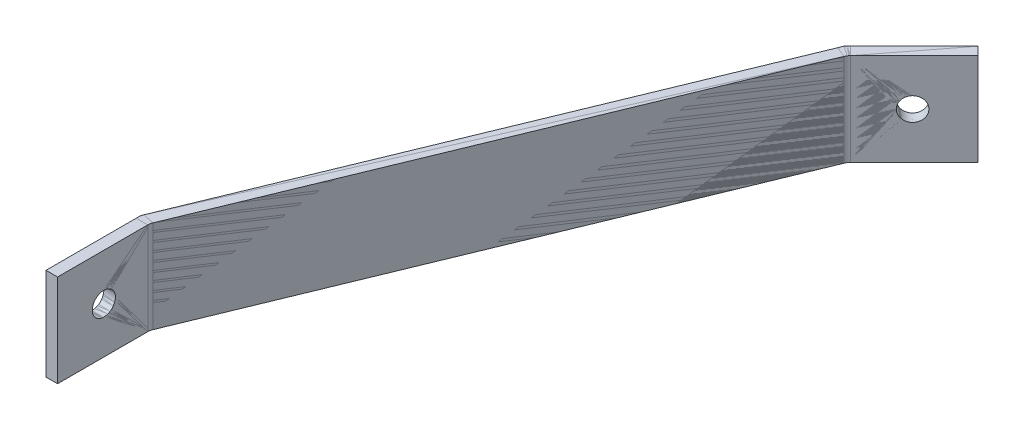
ISO-10303-21;
HEADER;
FILE_DESCRIPTION(('STEP AP214'),'2;1');
FILE_NAME('part.step','',(''),(''),'','','');
FILE_SCHEMA(('AUTOMOTIVE_DESIGN { 1 0 10303 214 1 1 1 1 }'));
ENDSEC;
DATA;
#1=APPLICATION_CONTEXT('core data for automotive mechanical design processes');
#2=APPLICATION_PROTOCOL_DEFINITION('international standard','automotive_design',2000,#1);
#3=PRODUCT_CONTEXT('',#1,'mechanical');
#4=PRODUCT('Part','Part','',(#3));
#5=PRODUCT_RELATED_PRODUCT_CATEGORY('part','',(#4));
#6=PRODUCT_DEFINITION_FORMATION('','',#4);
#7=PRODUCT_DEFINITION_CONTEXT('part definition',#1,'design');
#8=PRODUCT_DEFINITION('design','',#6,#7);
#9=PRODUCT_DEFINITION_SHAPE('','',#8);
#10=(LENGTH_UNIT() NAMED_UNIT(*) SI_UNIT(.MILLI.,.METRE.));
#11=(NAMED_UNIT(*) PLANE_ANGLE_UNIT() SI_UNIT($,.RADIAN.));
#12=(NAMED_UNIT(*) SI_UNIT($,.STERADIAN.) SOLID_ANGLE_UNIT());
#13=UNCERTAINTY_MEASURE_WITH_UNIT(LENGTH_MEASURE(1.E-05),#10,'distance_accuracy_value','');
#14=(GEOMETRIC_REPRESENTATION_CONTEXT(3) GLOBAL_UNCERTAINTY_ASSIGNED_CONTEXT((#13)) GLOBAL_UNIT_ASSIGNED_CONTEXT((#10,
#11,#12)) REPRESENTATION_CONTEXT('',''));
#15=CARTESIAN_POINT('',(0.,0.,0.));
#16=DIRECTION('',(0.,0.,1.));
#17=DIRECTION('',(1.,0.,0.));
#18=AXIS2_PLACEMENT_3D('',#15,#16,#17);
#19=CARTESIAN_POINT('',(62.3594592486435,801.004423501954,207.556093130892));
#20=DIRECTION('',(0.,1.,0.));
#21=DIRECTION('',(-0.380334686498912,0.,0.924848920768022));
#22=AXIS2_PLACEMENT_3D('',#19,#20,#21);
#23=PLANE('',#22);
#24=DIRECTION('',(0.924848920768021,0.,0.380334686498912));
#25=VECTOR('',#24,1.);
#26=CARTESIAN_POINT('',(62.1176648362832,801.004423501954,208.144057650715));
#27=LINE('',#26,#25);
#28=CARTESIAN_POINT('',(59.1812695128447,801.004423501954,206.936495021081));
#29=VERTEX_POINT('',#28);
#30=CARTESIAN_POINT('',(62.1176648362832,801.004423501954,208.144057650715));
#31=VERTEX_POINT('',#30);
#32=EDGE_CURVE('E13',#29,#31,#27,.T.);
#33=ORIENTED_EDGE('',*,*,#32,.F.);
#34=DIRECTION('',(0.380334686498912,0.,-0.924848920768021));
#35=VECTOR('',#34,1.);
#36=CARTESIAN_POINT('',(59.423063925205,801.004423501954,206.348530501258));
#37=LINE('',#36,#35);
#38=CARTESIAN_POINT('',(3.89063807930837,801.004423501954,341.38513361517));
#39=VERTEX_POINT('',#38);
#40=EDGE_CURVE('E207',#29,#39,#37,.F.);
#41=ORIENTED_EDGE('',*,*,#40,.T.);
#42=DIRECTION('',(0.92484892076802,0.,0.380334686498915));
#43=VECTOR('',#42,1.);
#44=CARTESIAN_POINT('',(6.82703340274684,801.004423501954,342.592696244804));
#45=LINE('',#44,#43);
#46=CARTESIAN_POINT('',(6.82703340274684,801.004423501954,342.592696244804));
#47=VERTEX_POINT('',#46);
#48=EDGE_CURVE('E70',#39,#47,#45,.T.);
#49=ORIENTED_EDGE('',*,*,#48,.T.);
#50=DIRECTION('',(-0.380334686498912,0.,0.924848920768022));
#51=VECTOR('',#50,1.);
#52=CARTESIAN_POINT('',(62.3594592486435,801.004423501954,207.556093130892));
#53=LINE('',#52,#51);
#54=EDGE_CURVE('E259',#31,#47,#53,.T.);
#55=ORIENTED_EDGE('',*,*,#54,.F.);
#56=EDGE_LOOP('',(#33,#41,#49,#55));
#57=FACE_BOUND('',#56,.T.);
#58=ADVANCED_FACE('F60',(#57),#23,.T.);
#59=CARTESIAN_POINT('',(9.76342872618532,801.004423501954,343.800258874438));
#60=DIRECTION('',(0.,1.,0.));
#61=DIRECTION('',(0.,0.,1.));
#62=AXIS2_PLACEMENT_3D('',#59,#60,#61);
#63=PLANE('',#62);
#64=ORIENTED_EDGE('',*,*,#48,.F.);
#65=CARTESIAN_POINT('',(9.76342872618532,801.004423501954,343.800258874438));
#66=DIRECTION('',(0.,1.,0.));
#67=DIRECTION('',(0.,0.,1.));
#68=AXIS2_PLACEMENT_3D('',#65,#66,#67);
#69=CIRCLE('',#68,6.35);
#70=CARTESIAN_POINT('',(3.41342872618532,801.004423501954,343.800258874438));
#71=VERTEX_POINT('',#70);
#72=EDGE_CURVE('E208',#39,#71,#69,.T.);
#73=ORIENTED_EDGE('',*,*,#72,.T.);
#74=DIRECTION('',(1.,0.,0.));
#75=VECTOR('',#74,1.);
#76=CARTESIAN_POINT('',(6.58842872618532,801.004423501954,343.800258874438));
#77=LINE('',#76,#75);
#78=CARTESIAN_POINT('',(6.58842872618532,801.004423501954,343.800258874438));
#79=VERTEX_POINT('',#78);
#80=EDGE_CURVE('E253',#71,#79,#77,.T.);
#81=ORIENTED_EDGE('',*,*,#80,.T.);
#82=CARTESIAN_POINT('',(9.76342872618532,801.004423501954,343.800258874438));
#83=DIRECTION('',(0.,-1.,0.));
#84=DIRECTION('',(0.,0.,-1.));
#85=AXIS2_PLACEMENT_3D('',#82,#83,#84);
#86=CIRCLE('',#85,3.175);
#87=EDGE_CURVE('E279',#47,#79,#86,.F.);
#88=ORIENTED_EDGE('',*,*,#87,.F.);
#89=EDGE_LOOP('',(#64,#73,#81,#88));
#90=FACE_BOUND('',#89,.T.);
#91=ADVANCED_FACE('F280',(#90),#63,.T.);
#92=CARTESIAN_POINT('',(6.58842872618532,801.004423501954,343.172904375804));
#93=DIRECTION('',(0.,1.,0.));
#94=DIRECTION('',(0.,0.,1.));
#95=AXIS2_PLACEMENT_3D('',#92,#93,#94);
#96=PLANE('',#95);
#97=ORIENTED_EDGE('',*,*,#80,.F.);
#98=DIRECTION('',(0.,0.,-1.));
#99=VECTOR('',#98,1.);
#100=CARTESIAN_POINT('',(3.41342872618532,801.004423501954,343.172904375804));
#101=LINE('',#100,#99);
#102=CARTESIAN_POINT('',(3.41342872618532,801.004423501954,368.572904375805));
#103=VERTEX_POINT('',#102);
#104=EDGE_CURVE('E216',#71,#103,#101,.F.);
#105=ORIENTED_EDGE('',*,*,#104,.T.);
#106=DIRECTION('',(1.,0.,0.));
#107=VECTOR('',#106,1.);
#108=CARTESIAN_POINT('',(6.58842872618532,801.004423501954,368.572904375805));
#109=LINE('',#108,#107);
#110=CARTESIAN_POINT('',(6.58842872618532,801.004423501954,368.572904375805));
#111=VERTEX_POINT('',#110);
#112=EDGE_CURVE('E250',#103,#111,#109,.T.);
#113=ORIENTED_EDGE('',*,*,#112,.T.);
#114=DIRECTION('',(0.,0.,1.));
#115=VECTOR('',#114,1.);
#116=CARTESIAN_POINT('',(6.58842872618532,801.004423501954,343.172904375804));
#117=LINE('',#116,#115);
#118=EDGE_CURVE('E335',#79,#111,#117,.T.);
#119=ORIENTED_EDGE('',*,*,#118,.F.);
#120=EDGE_LOOP('',(#97,#105,#113,#119));
#121=FACE_BOUND('',#120,.T.);
#122=ADVANCED_FACE('F333',(#121),#96,.T.);
#123=CARTESIAN_POINT('',(6.58842872618532,801.004423501954,368.572904375805));
#124=DIRECTION('',(0.,0.,1.));
#125=DIRECTION('',(0.,-1.,0.));
#126=AXIS2_PLACEMENT_3D('',#123,#124,#125);
#127=PLANE('',#126);
#128=ORIENTED_EDGE('',*,*,#112,.F.);
#129=DIRECTION('',(0.,1.,0.));
#130=VECTOR('',#129,1.);
#131=CARTESIAN_POINT('',(3.41342872618532,801.004423501954,368.572904375805));
#132=LINE('',#131,#130);
#133=CARTESIAN_POINT('',(3.41342872618532,775.604423501954,368.572904375805));
#134=VERTEX_POINT('',#133);
#135=EDGE_CURVE('E218',#103,#134,#132,.F.);
#136=ORIENTED_EDGE('',*,*,#135,.T.);
#137=DIRECTION('',(1.,0.,0.));
#138=VECTOR('',#137,1.);
#139=CARTESIAN_POINT('',(6.58842872618532,775.604423501954,368.572904375805));
#140=LINE('',#139,#138);
#141=CARTESIAN_POINT('',(6.58842872618532,775.604423501954,368.572904375805));
#142=VERTEX_POINT('',#141);
#143=EDGE_CURVE('E247',#134,#142,#140,.T.);
#144=ORIENTED_EDGE('',*,*,#143,.T.);
#145=DIRECTION('',(0.,-1.,0.));
#146=VECTOR('',#145,1.);
#147=CARTESIAN_POINT('',(6.58842872618532,801.004423501954,368.572904375805));
#148=LINE('',#147,#146);
#149=EDGE_CURVE('E343',#111,#142,#148,.T.);
#150=ORIENTED_EDGE('',*,*,#149,.F.);
#151=EDGE_LOOP('',(#128,#136,#144,#150));
#152=FACE_BOUND('',#151,.T.);
#153=ADVANCED_FACE('F627',(#152),#127,.T.);
#154=CARTESIAN_POINT('',(6.58842872618532,775.604423501954,343.172904375804));
#155=DIRECTION('',(0.,1.,0.));
#156=DIRECTION('',(0.,0.,1.));
#157=AXIS2_PLACEMENT_3D('',#154,#155,#156);
#158=PLANE('',#157);
#159=ORIENTED_EDGE('',*,*,#143,.F.);
#160=DIRECTION('',(0.,0.,-1.));
#161=VECTOR('',#160,1.);
#162=CARTESIAN_POINT('',(3.41342872618532,775.604423501954,343.172904375804));
#163=LINE('',#162,#161);
#164=CARTESIAN_POINT('',(3.41342872618532,775.604423501954,343.800258874438));
#165=VERTEX_POINT('',#164);
#166=EDGE_CURVE('E212',#165,#134,#163,.F.);
#167=ORIENTED_EDGE('',*,*,#166,.F.);
#168=DIRECTION('',(1.,0.,0.));
#169=VECTOR('',#168,1.);
#170=CARTESIAN_POINT('',(6.58842872618532,775.604423501954,343.800258874438));
#171=LINE('',#170,#169);
#172=CARTESIAN_POINT('',(6.58842872618532,775.604423501954,343.800258874438));
#173=VERTEX_POINT('',#172);
#174=EDGE_CURVE('E244',#165,#173,#171,.T.);
#175=ORIENTED_EDGE('',*,*,#174,.T.);
#176=DIRECTION('',(0.,0.,1.));
#177=VECTOR('',#176,1.);
#178=CARTESIAN_POINT('',(6.58842872618532,775.604423501954,343.172904375804));
#179=LINE('',#178,#177);
#180=EDGE_CURVE('E344',#173,#142,#179,.T.);
#181=ORIENTED_EDGE('',*,*,#180,.T.);
#182=EDGE_LOOP('',(#159,#167,#175,#181));
#183=FACE_BOUND('',#182,.T.);
#184=ADVANCED_FACE('F631',(#183),#158,.F.);
#185=CARTESIAN_POINT('',(9.76342872618532,775.604423501954,343.800258874438));
#186=DIRECTION('',(0.,-1.,0.));
#187=DIRECTION('',(0.,0.,-1.));
#188=AXIS2_PLACEMENT_3D('',#185,#186,#187);
#189=PLANE('',#188);
#190=ORIENTED_EDGE('',*,*,#174,.F.);
#191=CARTESIAN_POINT('',(9.76342872618532,775.604423501954,343.800258874438));
#192=DIRECTION('',(0.,1.,0.));
#193=DIRECTION('',(0.,0.,1.));
#194=AXIS2_PLACEMENT_3D('',#191,#192,#193);
#195=CIRCLE('',#194,6.35);
#196=CARTESIAN_POINT('',(3.89063807930839,775.604423501954,341.38513361517));
#197=VERTEX_POINT('',#196);
#198=EDGE_CURVE('E177',#165,#197,#195,.F.);
#199=ORIENTED_EDGE('',*,*,#198,.T.);
#200=DIRECTION('',(0.924848920768021,0.,0.380334686498912));
#201=VECTOR('',#200,1.);
#202=CARTESIAN_POINT('',(6.82703340274684,775.604423501954,342.592696244804));
#203=LINE('',#202,#201);
#204=CARTESIAN_POINT('',(6.82703340274684,775.604423501954,342.592696244804));
#205=VERTEX_POINT('',#204);
#206=EDGE_CURVE('E241',#197,#205,#203,.T.);
#207=ORIENTED_EDGE('',*,*,#206,.T.);
#208=CARTESIAN_POINT('',(9.76342872618532,775.604423501954,343.800258874438));
#209=DIRECTION('',(0.,1.,0.));
#210=DIRECTION('',(0.,0.,1.));
#211=AXIS2_PLACEMENT_3D('',#208,#209,#210);
#212=CIRCLE('',#211,3.175);
#213=EDGE_CURVE('E286',#173,#205,#212,.F.);
#214=ORIENTED_EDGE('',*,*,#213,.F.);
#215=EDGE_LOOP('',(#190,#199,#207,#214));
#216=FACE_BOUND('',#215,.T.);
#217=ADVANCED_FACE('F705',(#216),#189,.T.);
#218=CARTESIAN_POINT('',(62.3594592486435,775.604423501954,207.556093130892));
#219=DIRECTION('',(0.,1.,0.));
#220=DIRECTION('',(-0.380334686498912,0.,0.924848920768022));
#221=AXIS2_PLACEMENT_3D('',#218,#219,#220);
#222=PLANE('',#221);
#223=ORIENTED_EDGE('',*,*,#206,.F.);
#224=DIRECTION('',(0.380334686498912,0.,-0.924848920768021));
#225=VECTOR('',#224,1.);
#226=CARTESIAN_POINT('',(59.423063925205,775.604423501954,206.348530501258));
#227=LINE('',#226,#225);
#228=CARTESIAN_POINT('',(59.1812695128448,775.604423501954,206.936495021081));
#229=VERTEX_POINT('',#228);
#230=EDGE_CURVE('E203',#229,#197,#227,.F.);
#231=ORIENTED_EDGE('',*,*,#230,.F.);
#232=DIRECTION('',(0.924848920768022,0.,0.38033468649891));
#233=VECTOR('',#232,1.);
#234=CARTESIAN_POINT('',(62.1176648362832,775.604423501954,208.144057650715));
#235=LINE('',#234,#233);
#236=CARTESIAN_POINT('',(62.1176648362832,775.604423501954,208.144057650715));
#237=VERTEX_POINT('',#236);
#238=EDGE_CURVE('E82',#229,#237,#235,.T.);
#239=ORIENTED_EDGE('',*,*,#238,.T.);
#240=DIRECTION('',(-0.380334686498912,0.,0.924848920768022));
#241=VECTOR('',#240,1.);
#242=CARTESIAN_POINT('',(62.3594592486435,775.604423501954,207.556093130892));
#243=LINE('',#242,#241);
#244=EDGE_CURVE('E276',#237,#205,#243,.T.);
#245=ORIENTED_EDGE('',*,*,#244,.T.);
#246=EDGE_LOOP('',(#223,#231,#239,#245));
#247=FACE_BOUND('',#246,.T.);
#248=ADVANCED_FACE('F702',(#247),#222,.F.);
#249=CARTESIAN_POINT('',(65.0540601597217,775.604423501954,209.351620280349));
#250=DIRECTION('',(0.,-1.,0.));
#251=DIRECTION('',(0.,0.,-1.));
#252=AXIS2_PLACEMENT_3D('',#249,#250,#251);
#253=PLANE('',#252);
#254=ORIENTED_EDGE('',*,*,#238,.F.);
#255=CARTESIAN_POINT('',(65.0540601597217,775.604423501954,209.351620280349));
#256=DIRECTION('',(0.,1.,0.));
#257=DIRECTION('',(0.,0.,1.));
#258=AXIS2_PLACEMENT_3D('',#255,#256,#257);
#259=CIRCLE('',#258,6.35);
#260=CARTESIAN_POINT('',(60.5639320991871,775.604423501954,204.861492219814));
#261=VERTEX_POINT('',#260);
#262=EDGE_CURVE('E178',#229,#261,#259,.F.);
#263=ORIENTED_EDGE('',*,*,#262,.T.);
#264=DIRECTION('',(0.707106781186547,0.,0.707106781186548));
#265=VECTOR('',#264,1.);
#266=CARTESIAN_POINT('',(62.8089961294544,775.604423501954,207.106556250081));
#267=LINE('',#266,#265);
#268=CARTESIAN_POINT('',(62.8089961294544,775.604423501954,207.106556250081));
#269=VERTEX_POINT('',#268);
#270=EDGE_CURVE('E237',#261,#269,#267,.T.);
#271=ORIENTED_EDGE('',*,*,#270,.T.);
#272=CARTESIAN_POINT('',(65.0540601597217,775.604423501954,209.351620280349));
#273=DIRECTION('',(0.,1.,0.));
#274=DIRECTION('',(0.,0.,1.));
#275=AXIS2_PLACEMENT_3D('',#272,#273,#274);
#276=CIRCLE('',#275,3.175);
#277=EDGE_CURVE('E312',#237,#269,#276,.F.);
#278=ORIENTED_EDGE('',*,*,#277,.F.);
#279=EDGE_LOOP('',(#254,#263,#271,#278));
#280=FACE_BOUND('',#279,.T.);
#281=ADVANCED_FACE('F657',(#280),#253,.T.);
#282=CARTESIAN_POINT('',(80.3199714907836,775.604423501954,189.595580888752));
#283=DIRECTION('',(0.,1.,0.));
#284=DIRECTION('',(-0.707106781186548,0.,0.707106781186547));
#285=AXIS2_PLACEMENT_3D('',#282,#283,#284);
#286=PLANE('',#285);
#287=ORIENTED_EDGE('',*,*,#270,.F.);
#288=DIRECTION('',(0.707106781186548,0.,-0.707106781186547));
#289=VECTOR('',#288,1.);
#290=CARTESIAN_POINT('',(78.0749074605163,775.604423501954,187.350516858485));
#291=LINE('',#290,#289);
#292=CARTESIAN_POINT('',(78.0749074605163,775.604423501954,187.350516858485));
#293=VERTEX_POINT('',#292);
#294=EDGE_CURVE('E165',#293,#261,#291,.F.);
#295=ORIENTED_EDGE('',*,*,#294,.F.);
#296=DIRECTION('',(0.707106781186547,0.,0.707106781186548));
#297=VECTOR('',#296,1.);
#298=CARTESIAN_POINT('',(80.3199714907836,775.604423501954,189.595580888752));
#299=LINE('',#298,#297);
#300=CARTESIAN_POINT('',(80.3199714907836,775.604423501954,189.595580888752));
#301=VERTEX_POINT('',#300);
#302=EDGE_CURVE('E234',#293,#301,#299,.T.);
#303=ORIENTED_EDGE('',*,*,#302,.T.);
#304=DIRECTION('',(-0.707106781186548,0.,0.707106781186547));
#305=VECTOR('',#304,1.);
#306=CARTESIAN_POINT('',(80.3199714907836,775.604423501954,189.595580888752));
#307=LINE('',#306,#305);
#308=EDGE_CURVE('E641',#301,#269,#307,.T.);
#309=ORIENTED_EDGE('',*,*,#308,.T.);
#310=EDGE_LOOP('',(#287,#295,#303,#309));
#311=FACE_BOUND('',#310,.T.);
#312=ADVANCED_FACE('F654',(#311),#286,.F.);
#313=CARTESIAN_POINT('',(80.3199714907836,801.004423501954,189.595580888752));
#314=DIRECTION('',(-0.707106781186548,0.,0.707106781186547));
#315=DIRECTION('',(0.,-1.,0.));
#316=AXIS2_PLACEMENT_3D('',#313,#314,#315);
#317=PLANE('',#316);
#318=ORIENTED_EDGE('',*,*,#302,.F.);
#319=DIRECTION('',(0.,1.,0.));
#320=VECTOR('',#319,1.);
#321=CARTESIAN_POINT('',(78.0749074605163,801.004423501954,187.350516858485));
#322=LINE('',#321,#320);
#323=CARTESIAN_POINT('',(78.0749074605163,801.004423501954,187.350516858485));
#324=VERTEX_POINT('',#323);
#325=EDGE_CURVE('E185',#324,#293,#322,.F.);
#326=ORIENTED_EDGE('',*,*,#325,.F.);
#327=DIRECTION('',(0.707106781186547,0.,0.707106781186548));
#328=VECTOR('',#327,1.);
#329=CARTESIAN_POINT('',(80.3199714907836,801.004423501954,189.595580888752));
#330=LINE('',#329,#328);
#331=CARTESIAN_POINT('',(80.3199714907836,801.004423501954,189.595580888752));
#332=VERTEX_POINT('',#331);
#333=EDGE_CURVE('E154',#324,#332,#330,.T.);
#334=ORIENTED_EDGE('',*,*,#333,.T.);
#335=DIRECTION('',(0.,-1.,0.));
#336=VECTOR('',#335,1.);
#337=CARTESIAN_POINT('',(80.3199714907836,801.004423501954,189.595580888752));
#338=LINE('',#337,#336);
#339=EDGE_CURVE('E301',#332,#301,#338,.T.);
#340=ORIENTED_EDGE('',*,*,#339,.T.);
#341=EDGE_LOOP('',(#318,#326,#334,#340));
#342=FACE_BOUND('',#341,.T.);
#343=ADVANCED_FACE('F648',(#342),#317,.F.);
#344=CARTESIAN_POINT('',(80.3199714907836,801.004423501954,189.595580888752));
#345=DIRECTION('',(0.,1.,0.));
#346=DIRECTION('',(-0.707106781186548,0.,0.707106781186547));
#347=AXIS2_PLACEMENT_3D('',#344,#345,#346);
#348=PLANE('',#347);
#349=ORIENTED_EDGE('',*,*,#333,.F.);
#350=DIRECTION('',(0.707106781186548,0.,-0.707106781186547));
#351=VECTOR('',#350,1.);
#352=CARTESIAN_POINT('',(78.0749074605163,801.004423501954,187.350516858485));
#353=LINE('',#352,#351);
#354=CARTESIAN_POINT('',(60.5639320991871,801.004423501954,204.861492219814));
#355=VERTEX_POINT('',#354);
#356=EDGE_CURVE('E163',#324,#355,#353,.F.);
#357=ORIENTED_EDGE('',*,*,#356,.T.);
#358=DIRECTION('',(0.70710678118655,0.,0.707106781186545));
#359=VECTOR('',#358,1.);
#360=CARTESIAN_POINT('',(62.8089961294544,801.004423501954,207.106556250081));
#361=LINE('',#360,#359);
#362=CARTESIAN_POINT('',(62.8089961294544,801.004423501954,207.106556250081));
#363=VERTEX_POINT('',#362);
#364=EDGE_CURVE('E64',#355,#363,#361,.T.);
#365=ORIENTED_EDGE('',*,*,#364,.T.);
#366=DIRECTION('',(-0.707106781186548,0.,0.707106781186547));
#367=VECTOR('',#366,1.);
#368=CARTESIAN_POINT('',(80.3199714907836,801.004423501954,189.595580888752));
#369=LINE('',#368,#367);
#370=EDGE_CURVE('E293',#332,#363,#369,.T.);
#371=ORIENTED_EDGE('',*,*,#370,.F.);
#372=EDGE_LOOP('',(#349,#357,#365,#371));
#373=FACE_BOUND('',#372,.T.);
#374=ADVANCED_FACE('F180',(#373),#348,.T.);
#375=CARTESIAN_POINT('',(6.58842872618124,788.304423501954,355.872904375805));
#376=DIRECTION('',(1.,0.,0.));
#377=DIRECTION('',(0.,0.,-1.));
#378=AXIS2_PLACEMENT_3D('',#375,#376,#377);
#379=CYLINDRICAL_SURFACE('',#378,3.17500000000004);
#380=CARTESIAN_POINT('',(6.58842872618124,788.304423501954,355.872904375805));
#381=DIRECTION('',(1.,0.,0.));
#382=DIRECTION('',(0.,0.,-1.));
#383=AXIS2_PLACEMENT_3D('',#380,#381,#382);
#384=CIRCLE('',#383,3.17500000000004);
#385=CARTESIAN_POINT('',(6.58842872618124,788.304423501954,352.697904375805));
#386=VERTEX_POINT('',#385);
#387=EDGE_CURVE('E275',#386,#386,#384,.T.);
#388=ORIENTED_EDGE('',*,*,#387,.T.);
#389=EDGE_LOOP('',(#388));
#390=FACE_BOUND('',#389,.T.);
#391=CARTESIAN_POINT('',(3.41342872618124,788.304423501954,355.872904375805));
#392=DIRECTION('',(1.,0.,0.));
#393=DIRECTION('',(0.,0.,-1.));
#394=AXIS2_PLACEMENT_3D('',#391,#392,#393);
#395=CIRCLE('',#394,3.17500000000004);
#396=CARTESIAN_POINT('',(3.41342872618124,788.304423501954,352.697904375805));
#397=VERTEX_POINT('',#396);
#398=EDGE_CURVE('E217',#397,#397,#395,.T.);
#399=ORIENTED_EDGE('',*,*,#398,.F.);
#400=EDGE_LOOP('',(#399));
#401=FACE_BOUND('',#400,.T.);
#402=ADVANCED_FACE('F62',(#390,#401),#379,.F.);
#403=CARTESIAN_POINT('',(71.3397153697126,788.304423501954,198.575837009823));
#404=DIRECTION('',(0.707106781186547,0.,0.707106781186548));
#405=DIRECTION('',(0.707106781186548,0.,-0.707106781186547));
#406=AXIS2_PLACEMENT_3D('',#403,#404,#405);
#407=CYLINDRICAL_SURFACE('',#406,3.17499999999998);
#408=CARTESIAN_POINT('',(71.3397153697126,788.304423501954,198.575837009823));
#409=DIRECTION('',(0.707106781186547,0.,0.707106781186548));
#410=DIRECTION('',(0.707106781186548,0.,-0.707106781186547));
#411=AXIS2_PLACEMENT_3D('',#408,#409,#410);
#412=CIRCLE('',#411,3.17499999999998);
#413=CARTESIAN_POINT('',(73.5847793999799,788.304423501954,196.330772979556));
#414=VERTEX_POINT('',#413);
#415=EDGE_CURVE('E629',#414,#414,#412,.T.);
#416=CARTESIAN_POINT('',(69.0946513394453,788.304423501954,196.330772979556));
#417=DIRECTION('',(0.707106781186547,0.,0.707106781186548));
#418=DIRECTION('',(0.707106781186548,0.,-0.707106781186547));
#419=AXIS2_PLACEMENT_3D('',#416,#417,#418);
#420=CIRCLE('',#419,3.17499999999998);
#421=CARTESIAN_POINT('',(71.3397153697126,788.304423501954,194.085708949289));
#422=VERTEX_POINT('',#421);
#423=EDGE_CURVE('E196',#422,#422,#420,.T.);
#424=CARTESIAN_POINT('',(73.5847793999799,788.304423501954,196.330772979556));
#425=CARTESIAN_POINT('',(73.5613933163313,788.304423501954,196.307386895907));
#426=CARTESIAN_POINT('',(73.5380072326827,788.304423501954,196.284000812259));
#427=CARTESIAN_POINT('',(73.4912350653855,788.304423501954,196.237228644962));
#428=CARTESIAN_POINT('',(73.4678489817368,788.304423501954,196.213842561313));
#429=CARTESIAN_POINT('',(73.4210768144396,788.304423501954,196.167070394016));
#430=CARTESIAN_POINT('',(73.397690730791,788.304423501954,196.143684310367));
#431=CARTESIAN_POINT('',(73.3509185634937,788.304423501954,196.09691214307));
#432=CARTESIAN_POINT('',(73.3275324798451,788.304423501954,196.073526059421));
#433=CARTESIAN_POINT('',(73.2807603125479,788.304423501954,196.026753892124));
#434=CARTESIAN_POINT('',(73.2573742288993,788.304423501954,196.003367808475));
#435=CARTESIAN_POINT('',(73.210602061602,788.304423501954,195.956595641178));
#436=CARTESIAN_POINT('',(73.1872159779534,788.304423501954,195.93320955753));
#437=CARTESIAN_POINT('',(73.1404438106562,788.304423501954,195.886437390232));
#438=CARTESIAN_POINT('',(73.1170577270076,788.304423501954,195.863051306584));
#439=CARTESIAN_POINT('',(73.0702855597103,788.304423501954,195.816279139286));
#440=CARTESIAN_POINT('',(73.0468994760617,788.304423501954,195.792893055638));
#441=CARTESIAN_POINT('',(73.0001273087645,788.304423501954,195.746120888341));
#442=CARTESIAN_POINT('',(72.9767412251159,788.304423501954,195.722734804692));
#443=CARTESIAN_POINT('',(72.9299690578186,788.304423501954,195.675962637395));
#444=CARTESIAN_POINT('',(72.90658297417,788.304423501954,195.652576553746));
#445=CARTESIAN_POINT('',(72.8598108068728,788.304423501954,195.605804386449));
#446=CARTESIAN_POINT('',(72.8364247232242,788.304423501954,195.5824183028));
#447=CARTESIAN_POINT('',(72.7896525559269,788.304423501954,195.535646135503));
#448=CARTESIAN_POINT('',(72.7662664722783,788.304423501954,195.512260051854));
#449=CARTESIAN_POINT('',(72.7194943049811,788.304423501954,195.465487884557));
#450=CARTESIAN_POINT('',(72.6961082213325,788.304423501954,195.442101800909));
#451=CARTESIAN_POINT('',(72.6493360540352,788.304423501954,195.395329633611));
#452=CARTESIAN_POINT('',(72.6259499703866,788.304423501954,195.371943549963));
#453=CARTESIAN_POINT('',(72.5791778030894,788.304423501954,195.325171382666));
#454=CARTESIAN_POINT('',(72.5557917194407,788.304423501954,195.301785299017));
#455=CARTESIAN_POINT('',(72.5090195521435,788.304423501954,195.25501313172));
#456=CARTESIAN_POINT('',(72.4856334684949,788.304423501954,195.231627048071));
#457=CARTESIAN_POINT('',(72.4388613011977,788.304423501954,195.184854880774));
#458=CARTESIAN_POINT('',(72.415475217549,788.304423501954,195.161468797125));
#459=CARTESIAN_POINT('',(72.3687030502518,788.304423501954,195.114696629828));
#460=CARTESIAN_POINT('',(72.3453169666032,788.304423501954,195.091310546179));
#461=CARTESIAN_POINT('',(72.298544799306,788.304423501954,195.044538378882));
#462=CARTESIAN_POINT('',(72.2751587156573,788.304423501954,195.021152295233));
#463=CARTESIAN_POINT('',(72.2283865483601,788.304423501954,194.974380127936));
#464=CARTESIAN_POINT('',(72.2050004647115,788.304423501954,194.950994044288));
#465=CARTESIAN_POINT('',(72.1582282974143,788.304423501954,194.90422187699));
#466=CARTESIAN_POINT('',(72.1348422137656,788.304423501954,194.880835793342));
#467=CARTESIAN_POINT('',(72.0880700464684,788.304423501954,194.834063626045));
#468=CARTESIAN_POINT('',(72.0646839628198,788.304423501954,194.810677542396));
#469=CARTESIAN_POINT('',(72.0179117955225,788.304423501954,194.763905375099));
#470=CARTESIAN_POINT('',(71.9945257118739,788.304423501954,194.74051929145));
#471=CARTESIAN_POINT('',(71.9477535445767,788.304423501954,194.693747124153));
#472=CARTESIAN_POINT('',(71.9243674609281,788.304423501954,194.670361040504));
#473=CARTESIAN_POINT('',(71.8775952936308,788.304423501954,194.623588873207));
#474=CARTESIAN_POINT('',(71.8542092099822,788.304423501954,194.600202789558));
#475=CARTESIAN_POINT('',(71.807437042685,788.304423501954,194.553430622261));
#476=CARTESIAN_POINT('',(71.7840509590364,788.304423501954,194.530044538613));
#477=CARTESIAN_POINT('',(71.7372787917391,788.304423501954,194.483272371315));
#478=CARTESIAN_POINT('',(71.7138927080905,788.304423501954,194.459886287667));
#479=CARTESIAN_POINT('',(71.6671205407933,788.304423501954,194.413114120369));
#480=CARTESIAN_POINT('',(71.6437344571447,788.304423501954,194.389728036721));
#481=CARTESIAN_POINT('',(71.5969622898474,788.304423501954,194.342955869424));
#482=CARTESIAN_POINT('',(71.5735762061988,788.304423501954,194.319569785775));
#483=CARTESIAN_POINT('',(71.5268040389016,788.304423501954,194.272797618478));
#484=CARTESIAN_POINT('',(71.503417955253,788.304423501954,194.249411534829));
#485=CARTESIAN_POINT('',(71.4566457879557,788.304423501954,194.202639367532));
#486=CARTESIAN_POINT('',(71.4332597043071,788.304423501954,194.179253283883));
#487=CARTESIAN_POINT('',(71.3864875370099,788.304423501954,194.132481116586));
#488=CARTESIAN_POINT('',(71.3631014533613,788.304423501954,194.109095032937));
#489=CARTESIAN_POINT('',(71.3397153697126,788.304423501954,194.085708949289));
#490=B_SPLINE_CURVE_WITH_KNOTS('',3,(#424,#425,#426,#427,#428,#429,#430,#431,#432,#433,#434,
#435,#436,#437,#438,#439,#440,#441,#442,#443,#444,#445,#446,#447,#448,#449,#450,#451,#452,#453,
#454,#455,#456,#457,#458,#459,#460,#461,#462,#463,#464,#465,#466,#467,#468,#469,#470,#471,#472,
#473,#474,#475,#476,#477,#478,#479,#480,#481,#482,#483,#484,#485,#486,#487,#488,#489),
.UNSPECIFIED.,.F.,.F.,(4,2,2,2,2,2,2,2,2,2,2,2,2,2,2,2,2,2,2,2,2,2,2,2,2,2,2,2,2,2,2,2,4),(0.,
0.0992187499999935,0.198437499999997,0.29765625,0.396874999999994,0.496093749999997,0.5953125,
0.694531249999994,0.793749999999997,0.89296875,0.992187499999994,1.09140625,1.190625,
1.28984374999999,1.3890625,1.48828125,1.58749999999999,1.68671875,1.7859375,1.88515624999998,
1.984375,2.08359375,2.18281249999998,2.28203125,2.38125,2.48046874999998,2.5796875,2.67890625,
2.77812499999999,2.87734375,2.97656249999998,3.07578124999999,3.17499999999999),.UNSPECIFIED.);
#491=EDGE_CURVE('BSEAM677',#414,#422,#490,.T.);
#492=ORIENTED_EDGE('',*,*,#415,.T.);
#493=ORIENTED_EDGE('',*,*,#423,.F.);
#494=ORIENTED_EDGE('',*,*,#491,.T.);
#495=ORIENTED_EDGE('',*,*,#491,.F.);
#496=EDGE_LOOP('',(#492,#494,#493,#495));
#497=FACE_BOUND('',#496,.T.);
#498=ADVANCED_FACE('F677',(#497),#407,.F.);
#499=CARTESIAN_POINT('',(65.0540601597217,801.004423501954,209.351620280349));
#500=DIRECTION('',(0.,1.,0.));
#501=DIRECTION('',(0.,0.,1.));
#502=AXIS2_PLACEMENT_3D('',#499,#500,#501);
#503=PLANE('',#502);
#504=CARTESIAN_POINT('',(65.0540601597217,801.004423501954,209.351620280349));
#505=DIRECTION('',(0.,1.,0.));
#506=DIRECTION('',(0.,0.,1.));
#507=AXIS2_PLACEMENT_3D('',#504,#505,#506);
#508=CIRCLE('',#507,6.35);
#509=EDGE_CURVE('E147',#355,#29,#508,.T.);
#510=ORIENTED_EDGE('',*,*,#509,.T.);
#511=ORIENTED_EDGE('',*,*,#32,.T.);
#512=CARTESIAN_POINT('',(65.0540601597217,801.004423501954,209.351620280349));
#513=DIRECTION('',(0.,-1.,0.));
#514=DIRECTION('',(0.,0.,-1.));
#515=AXIS2_PLACEMENT_3D('',#512,#513,#514);
#516=CIRCLE('',#515,3.175);
#517=EDGE_CURVE('E149',#363,#31,#516,.F.);
#518=ORIENTED_EDGE('',*,*,#517,.F.);
#519=ORIENTED_EDGE('',*,*,#364,.F.);
#520=EDGE_LOOP('',(#510,#511,#518,#519));
#521=FACE_BOUND('',#520,.T.);
#522=ADVANCED_FACE('F145',(#521),#503,.T.);
#523=CARTESIAN_POINT('',(80.3199714907836,801.004423501954,189.595580888752));
#524=DIRECTION('',(0.707106781186547,0.,0.707106781186548));
#525=DIRECTION('',(0.707106781186548,0.,-0.707106781186547));
#526=AXIS2_PLACEMENT_3D('',#523,#524,#525);
#527=PLANE('',#526);
#528=ORIENTED_EDGE('',*,*,#415,.F.);
#529=EDGE_LOOP('',(#528));
#530=FACE_BOUND('',#529,.T.);
#531=ORIENTED_EDGE('',*,*,#370,.T.);
#532=DIRECTION('',(0.,-1.,0.));
#533=VECTOR('',#532,1.);
#534=CARTESIAN_POINT('',(62.8089961294544,775.604423501954,207.106556250081));
#535=LINE('',#534,#533);
#536=EDGE_CURVE('E299',#363,#269,#535,.T.);
#537=ORIENTED_EDGE('',*,*,#536,.T.);
#538=ORIENTED_EDGE('',*,*,#308,.F.);
#539=ORIENTED_EDGE('',*,*,#339,.F.);
#540=EDGE_LOOP('',(#531,#537,#538,#539));
#541=FACE_BOUND('',#540,.T.);
#542=ADVANCED_FACE('F651',(#530,#541),#527,.T.);
#543=CARTESIAN_POINT('',(6.58842872618532,801.004423501954,343.172904375804));
#544=DIRECTION('',(1.,0.,0.));
#545=DIRECTION('',(0.,0.,-1.));
#546=AXIS2_PLACEMENT_3D('',#543,#544,#545);
#547=PLANE('',#546);
#548=ORIENTED_EDGE('',*,*,#387,.F.);
#549=EDGE_LOOP('',(#548));
#550=FACE_BOUND('',#549,.T.);
#551=ORIENTED_EDGE('',*,*,#180,.F.);
#552=DIRECTION('',(0.,-1.,0.));
#553=VECTOR('',#552,1.);
#554=CARTESIAN_POINT('',(6.58842872618532,801.004423501954,343.800258874438));
#555=LINE('',#554,#553);
#556=EDGE_CURVE('E292',#173,#79,#555,.F.);
#557=ORIENTED_EDGE('',*,*,#556,.T.);
#558=ORIENTED_EDGE('',*,*,#118,.T.);
#559=ORIENTED_EDGE('',*,*,#149,.T.);
#560=EDGE_LOOP('',(#551,#557,#558,#559));
#561=FACE_BOUND('',#560,.T.);
#562=ADVANCED_FACE('F347',(#550,#561),#547,.T.);
#563=CARTESIAN_POINT('',(62.3594592486435,801.004423501954,207.556093130892));
#564=DIRECTION('',(0.924848920768021,0.,0.380334686498912));
#565=DIRECTION('',(0.380334686498912,0.,-0.924848920768021));
#566=AXIS2_PLACEMENT_3D('',#563,#564,#565);
#567=PLANE('',#566);
#568=ORIENTED_EDGE('',*,*,#244,.F.);
#569=DIRECTION('',(0.,-1.,0.));
#570=VECTOR('',#569,1.);
#571=CARTESIAN_POINT('',(62.1176648362832,801.004423501954,208.144057650715));
#572=LINE('',#571,#570);
#573=EDGE_CURVE('E155',#237,#31,#572,.F.);
#574=ORIENTED_EDGE('',*,*,#573,.T.);
#575=ORIENTED_EDGE('',*,*,#54,.T.);
#576=DIRECTION('',(0.,-1.,0.));
#577=VECTOR('',#576,1.);
#578=CARTESIAN_POINT('',(6.82703340274684,775.604423501954,342.592696244804));
#579=LINE('',#578,#577);
#580=EDGE_CURVE('E272',#47,#205,#579,.T.);
#581=ORIENTED_EDGE('',*,*,#580,.T.);
#582=EDGE_LOOP('',(#568,#574,#575,#581));
#583=FACE_BOUND('',#582,.T.);
#584=ADVANCED_FACE('F270',(#583),#567,.T.);
#585=CARTESIAN_POINT('',(9.76342872618532,801.004423501954,343.800258874438));
#586=DIRECTION('',(0.,1.,0.));
#587=DIRECTION('',(0.,0.,1.));
#588=AXIS2_PLACEMENT_3D('',#585,#586,#587);
#589=CYLINDRICAL_SURFACE('',#588,3.175);
#590=ORIENTED_EDGE('',*,*,#87,.T.);
#591=ORIENTED_EDGE('',*,*,#556,.F.);
#592=ORIENTED_EDGE('',*,*,#213,.T.);
#593=ORIENTED_EDGE('',*,*,#580,.F.);
#594=EDGE_LOOP('',(#590,#591,#592,#593));
#595=FACE_BOUND('',#594,.T.);
#596=ADVANCED_FACE('F289',(#595),#589,.F.);
#597=CARTESIAN_POINT('',(65.0540601597217,801.004423501954,209.351620280349));
#598=DIRECTION('',(0.,1.,0.));
#599=DIRECTION('',(0.,0.,1.));
#600=AXIS2_PLACEMENT_3D('',#597,#598,#599);
#601=CYLINDRICAL_SURFACE('',#600,3.175);
#602=ORIENTED_EDGE('',*,*,#517,.T.);
#603=ORIENTED_EDGE('',*,*,#573,.F.);
#604=ORIENTED_EDGE('',*,*,#277,.T.);
#605=ORIENTED_EDGE('',*,*,#536,.F.);
#606=EDGE_LOOP('',(#602,#603,#604,#605));
#607=FACE_BOUND('',#606,.T.);
#608=ADVANCED_FACE('F659',(#607),#601,.F.);
#609=CARTESIAN_POINT('',(78.0749074605163,801.004423501954,187.350516858485));
#610=DIRECTION('',(0.707106781186547,0.,0.707106781186548));
#611=DIRECTION('',(0.707106781186548,0.,-0.707106781186547));
#612=AXIS2_PLACEMENT_3D('',#609,#610,#611);
#613=PLANE('',#612);
#614=ORIENTED_EDGE('',*,*,#423,.T.);
#615=EDGE_LOOP('',(#614));
#616=FACE_BOUND('',#615,.T.);
#617=ORIENTED_EDGE('',*,*,#356,.F.);
#618=ORIENTED_EDGE('',*,*,#325,.T.);
#619=ORIENTED_EDGE('',*,*,#294,.T.);
#620=DIRECTION('',(0.,1.,0.));
#621=VECTOR('',#620,1.);
#622=CARTESIAN_POINT('',(60.5639320991871,801.004423501954,204.861492219814));
#623=LINE('',#622,#621);
#624=EDGE_CURVE('E160',#355,#261,#623,.F.);
#625=ORIENTED_EDGE('',*,*,#624,.F.);
#626=EDGE_LOOP('',(#617,#618,#619,#625));
#627=FACE_BOUND('',#626,.T.);
#628=ADVANCED_FACE('F161',(#616,#627),#613,.F.);
#629=CARTESIAN_POINT('',(3.41342872618532,801.004423501954,343.172904375804));
#630=DIRECTION('',(1.,0.,0.));
#631=DIRECTION('',(0.,0.,-1.));
#632=AXIS2_PLACEMENT_3D('',#629,#630,#631);
#633=PLANE('',#632);
#634=ORIENTED_EDGE('',*,*,#398,.T.);
#635=EDGE_LOOP('',(#634));
#636=FACE_BOUND('',#635,.T.);
#637=ORIENTED_EDGE('',*,*,#166,.T.);
#638=ORIENTED_EDGE('',*,*,#135,.F.);
#639=ORIENTED_EDGE('',*,*,#104,.F.);
#640=DIRECTION('',(0.,1.,0.));
#641=VECTOR('',#640,1.);
#642=CARTESIAN_POINT('',(3.41342872618532,801.004423501954,343.800258874438));
#643=LINE('',#642,#641);
#644=EDGE_CURVE('E171',#165,#71,#643,.T.);
#645=ORIENTED_EDGE('',*,*,#644,.F.);
#646=EDGE_LOOP('',(#637,#638,#639,#645));
#647=FACE_BOUND('',#646,.T.);
#648=ADVANCED_FACE('F331',(#636,#647),#633,.F.);
#649=CARTESIAN_POINT('',(59.423063925205,801.004423501954,206.348530501258));
#650=DIRECTION('',(0.924848920768021,0.,0.380334686498912));
#651=DIRECTION('',(0.380334686498912,0.,-0.924848920768021));
#652=AXIS2_PLACEMENT_3D('',#649,#650,#651);
#653=PLANE('',#652);
#654=ORIENTED_EDGE('',*,*,#230,.T.);
#655=DIRECTION('',(0.,1.,0.));
#656=VECTOR('',#655,1.);
#657=CARTESIAN_POINT('',(3.89063807930837,801.004423501954,341.38513361517));
#658=LINE('',#657,#656);
#659=EDGE_CURVE('E184',#39,#197,#658,.F.);
#660=ORIENTED_EDGE('',*,*,#659,.F.);
#661=ORIENTED_EDGE('',*,*,#40,.F.);
#662=DIRECTION('',(0.,1.,0.));
#663=VECTOR('',#662,1.);
#664=CARTESIAN_POINT('',(59.1812695128448,801.004423501954,206.936495021081));
#665=LINE('',#664,#663);
#666=EDGE_CURVE('E170',#229,#29,#665,.T.);
#667=ORIENTED_EDGE('',*,*,#666,.F.);
#668=EDGE_LOOP('',(#654,#660,#661,#667));
#669=FACE_BOUND('',#668,.T.);
#670=ADVANCED_FACE('F1034',(#669),#653,.F.);
#671=CARTESIAN_POINT('',(9.76342872618532,801.004423501954,343.800258874438));
#672=DIRECTION('',(0.,1.,0.));
#673=DIRECTION('',(0.,0.,1.));
#674=AXIS2_PLACEMENT_3D('',#671,#672,#673);
#675=CYLINDRICAL_SURFACE('',#674,6.35);
#676=ORIENTED_EDGE('',*,*,#72,.F.);
#677=ORIENTED_EDGE('',*,*,#659,.T.);
#678=ORIENTED_EDGE('',*,*,#198,.F.);
#679=ORIENTED_EDGE('',*,*,#644,.T.);
#680=EDGE_LOOP('',(#676,#677,#678,#679));
#681=FACE_BOUND('',#680,.T.);
#682=ADVANCED_FACE('F327',(#681),#675,.T.);
#683=CARTESIAN_POINT('',(65.0540601597217,801.004423501954,209.351620280349));
#684=DIRECTION('',(0.,1.,0.));
#685=DIRECTION('',(0.,0.,1.));
#686=AXIS2_PLACEMENT_3D('',#683,#684,#685);
#687=CYLINDRICAL_SURFACE('',#686,6.35);
#688=ORIENTED_EDGE('',*,*,#509,.F.);
#689=ORIENTED_EDGE('',*,*,#624,.T.);
#690=ORIENTED_EDGE('',*,*,#262,.F.);
#691=ORIENTED_EDGE('',*,*,#666,.T.);
#692=EDGE_LOOP('',(#688,#689,#690,#691));
#693=FACE_BOUND('',#692,.T.);
#694=ADVANCED_FACE('F173',(#693),#687,.T.);
#695=CLOSED_SHELL('',(#58,#91,#122,#153,#184,#217,#248,#281,#312,#343,#374,#402,#498,#522,#542,
#562,#584,#596,#608,#628,#648,#670,#682,#694));
#696=MANIFOLD_SOLID_BREP('B2',#695);
#697=CARTESIAN_POINT('',(3.41342872618532,801.004423501954,343.172904375804));
#698=DIRECTION('',(1.,0.,0.));
#699=DIRECTION('',(0.,0.,-1.));
#700=AXIS2_PLACEMENT_3D('',#697,#698,#699);
#701=PLANE('',#700);
#702=CARTESIAN_POINT('',(3.41342872618532,788.304423501954,355.872904375805));
#703=DIRECTION('',(1.,0.,0.));
#704=DIRECTION('',(0.,0.,-1.));
#705=AXIS2_PLACEMENT_3D('',#702,#703,#704);
#706=CIRCLE('',#705,3.17500000000004);
#707=CARTESIAN_POINT('',(3.41342872618532,788.304423501954,352.697904375805));
#708=VERTEX_POINT('',#707);
#709=EDGE_CURVE('E1790',#708,#708,#706,.F.);
#710=ORIENTED_EDGE('',*,*,#709,.F.);
#711=EDGE_LOOP('',(#710));
#712=FACE_BOUND('',#711,.T.);
#713=DIRECTION('',(0.,0.,1.));
#714=VECTOR('',#713,1.);
#715=CARTESIAN_POINT('',(3.41342872618532,775.604423501954,343.172904375804));
#716=LINE('',#715,#714);
#717=CARTESIAN_POINT('',(3.41342872618532,775.604423501954,342.545549877171));
#718=VERTEX_POINT('',#717);
#719=CARTESIAN_POINT('',(3.41342872618532,775.604423501954,368.572904375805));
#720=VERTEX_POINT('',#719);
#721=EDGE_CURVE('E1731',#718,#720,#716,.T.);
#722=ORIENTED_EDGE('',*,*,#721,.T.);
#723=DIRECTION('',(0.,-1.,0.));
#724=VECTOR('',#723,1.);
#725=CARTESIAN_POINT('',(3.41342872618532,801.004423501954,368.572904375805));
#726=LINE('',#725,#724);
#727=CARTESIAN_POINT('',(3.41342872618532,801.004423501954,368.572904375805));
#728=VERTEX_POINT('',#727);
#729=EDGE_CURVE('E58',#728,#720,#726,.T.);
#730=ORIENTED_EDGE('',*,*,#729,.F.);
#731=DIRECTION('',(0.,0.,1.));
#732=VECTOR('',#731,1.);
#733=CARTESIAN_POINT('',(3.41342872618532,801.004423501954,343.172904375804));
#734=LINE('',#733,#732);
#735=CARTESIAN_POINT('',(3.41342872618532,801.004423501954,342.545549877171));
#736=VERTEX_POINT('',#735);
#737=EDGE_CURVE('E1688',#736,#728,#734,.T.);
#738=ORIENTED_EDGE('',*,*,#737,.F.);
#739=DIRECTION('',(0.,-1.,0.));
#740=VECTOR('',#739,1.);
#741=CARTESIAN_POINT('',(3.41342872618532,801.004423501954,342.545549877171));
#742=LINE('',#741,#740);
#743=EDGE_CURVE('E1730',#736,#718,#742,.T.);
#744=ORIENTED_EDGE('',*,*,#743,.T.);
#745=EDGE_LOOP('',(#722,#730,#738,#744));
#746=FACE_BOUND('',#745,.T.);
#747=ADVANCED_FACE('F1632',(#712,#746),#701,.F.);
#748=CARTESIAN_POINT('',(6.58842872618532,801.004423501954,368.572904375805));
#749=DIRECTION('',(0.,0.,1.));
#750=DIRECTION('',(1.,0.,0.));
#751=AXIS2_PLACEMENT_3D('',#748,#749,#750);
#752=PLANE('',#751);
#753=DIRECTION('',(-1.,0.,0.));
#754=VECTOR('',#753,1.);
#755=CARTESIAN_POINT('',(6.58842872618532,775.604423501954,368.572904375805));
#756=LINE('',#755,#754);
#757=CARTESIAN_POINT('',(6.58842872618532,775.604423501954,368.572904375805));
#758=VERTEX_POINT('',#757);
#759=EDGE_CURVE('E1734',#758,#720,#756,.T.);
#760=ORIENTED_EDGE('',*,*,#759,.F.);
#761=DIRECTION('',(0.,-1.,0.));
#762=VECTOR('',#761,1.);
#763=CARTESIAN_POINT('',(6.58842872618532,801.004423501954,368.572904375805));
#764=LINE('',#763,#762);
#765=CARTESIAN_POINT('',(6.58842872618532,801.004423501954,368.572904375805));
#766=VERTEX_POINT('',#765);
#767=EDGE_CURVE('E1641',#766,#758,#764,.T.);
#768=ORIENTED_EDGE('',*,*,#767,.F.);
#769=DIRECTION('',(-1.,0.,0.));
#770=VECTOR('',#769,1.);
#771=CARTESIAN_POINT('',(6.58842872618532,801.004423501954,368.572904375805));
#772=LINE('',#771,#770);
#773=EDGE_CURVE('E1781',#766,#728,#772,.T.);
#774=ORIENTED_EDGE('',*,*,#773,.T.);
#775=ORIENTED_EDGE('',*,*,#729,.T.);
#776=EDGE_LOOP('',(#760,#768,#774,#775));
#777=FACE_BOUND('',#776,.T.);
#778=ADVANCED_FACE('F1772',(#777),#752,.T.);
#779=CARTESIAN_POINT('',(6.58842872618532,801.004423501954,343.172904375804));
#780=DIRECTION('',(1.,0.,0.));
#781=DIRECTION('',(0.,0.,-1.));
#782=AXIS2_PLACEMENT_3D('',#779,#780,#781);
#783=PLANE('',#782);
#784=CARTESIAN_POINT('',(6.58842872618124,788.304423501954,355.872904375805));
#785=DIRECTION('',(1.,0.,0.));
#786=DIRECTION('',(0.,0.,-1.));
#787=AXIS2_PLACEMENT_3D('',#784,#785,#786);
#788=CIRCLE('',#787,3.17500000000004);
#789=CARTESIAN_POINT('',(6.58842872618124,788.304423501954,352.697904375805));
#790=VERTEX_POINT('',#789);
#791=EDGE_CURVE('E1793',#790,#790,#788,.T.);
#792=ORIENTED_EDGE('',*,*,#791,.F.);
#793=EDGE_LOOP('',(#792));
#794=FACE_BOUND('',#793,.T.);
#795=DIRECTION('',(0.,0.,1.));
#796=VECTOR('',#795,1.);
#797=CARTESIAN_POINT('',(6.58842872618532,775.604423501954,343.172904375804));
#798=LINE('',#797,#796);
#799=CARTESIAN_POINT('',(6.58842872618532,775.604423501954,343.172904375804));
#800=VERTEX_POINT('',#799);
#801=EDGE_CURVE('E1737',#800,#758,#798,.T.);
#802=ORIENTED_EDGE('',*,*,#801,.F.);
#803=DIRECTION('',(0.,-1.,0.));
#804=VECTOR('',#803,1.);
#805=CARTESIAN_POINT('',(6.58842872618532,801.004423501954,343.172904375804));
#806=LINE('',#805,#804);
#807=CARTESIAN_POINT('',(6.58842872618532,801.004423501954,343.172904375804));
#808=VERTEX_POINT('',#807);
#809=EDGE_CURVE('E1758',#808,#800,#806,.T.);
#810=ORIENTED_EDGE('',*,*,#809,.F.);
#811=DIRECTION('',(0.,0.,1.));
#812=VECTOR('',#811,1.);
#813=CARTESIAN_POINT('',(6.58842872618532,801.004423501954,343.172904375804));
#814=LINE('',#813,#812);
#815=EDGE_CURVE('E1769',#808,#766,#814,.T.);
#816=ORIENTED_EDGE('',*,*,#815,.T.);
#817=ORIENTED_EDGE('',*,*,#767,.T.);
#818=EDGE_LOOP('',(#802,#810,#816,#817));
#819=FACE_BOUND('',#818,.T.);
#820=ADVANCED_FACE('F1767',(#794,#819),#783,.T.);
#821=CARTESIAN_POINT('',(62.3594592486435,801.004423501954,207.556093130892));
#822=DIRECTION('',(0.924848920768021,0.,0.380334686498912));
#823=DIRECTION('',(0.380334686498912,0.,-0.924848920768021));
#824=AXIS2_PLACEMENT_3D('',#821,#822,#823);
#825=PLANE('',#824);
#826=DIRECTION('',(-0.380334686498912,0.,0.924848920768022));
#827=VECTOR('',#826,1.);
#828=CARTESIAN_POINT('',(62.3594592486435,775.604423501954,207.556093130892));
#829=LINE('',#828,#827);
#830=CARTESIAN_POINT('',(62.3594592486435,775.604423501954,207.556093130892));
#831=VERTEX_POINT('',#830);
#832=EDGE_CURVE('E1741',#831,#800,#829,.T.);
#833=ORIENTED_EDGE('',*,*,#832,.F.);
#834=DIRECTION('',(0.,-1.,0.));
#835=VECTOR('',#834,1.);
#836=CARTESIAN_POINT('',(62.3594592486435,801.004423501954,207.556093130892));
#837=LINE('',#836,#835);
#838=CARTESIAN_POINT('',(62.3594592486435,801.004423501954,207.556093130892));
#839=VERTEX_POINT('',#838);
#840=EDGE_CURVE('E1756',#839,#831,#837,.T.);
#841=ORIENTED_EDGE('',*,*,#840,.F.);
#842=DIRECTION('',(-0.380334686498912,0.,0.924848920768022));
#843=VECTOR('',#842,1.);
#844=CARTESIAN_POINT('',(62.3594592486435,801.004423501954,207.556093130892));
#845=LINE('',#844,#843);
#846=EDGE_CURVE('E1725',#839,#808,#845,.T.);
#847=ORIENTED_EDGE('',*,*,#846,.T.);
#848=ORIENTED_EDGE('',*,*,#809,.T.);
#849=EDGE_LOOP('',(#833,#841,#847,#848));
#850=FACE_BOUND('',#849,.T.);
#851=ADVANCED_FACE('F1779',(#850),#825,.T.);
#852=CARTESIAN_POINT('',(80.3199714907836,801.004423501954,189.595580888752));
#853=DIRECTION('',(0.707106781186547,0.,0.707106781186548));
#854=DIRECTION('',(0.707106781186548,0.,-0.707106781186547));
#855=AXIS2_PLACEMENT_3D('',#852,#853,#854);
#856=PLANE('',#855);
#857=CARTESIAN_POINT('',(71.3397153697126,788.304423501954,198.575837009823));
#858=DIRECTION('',(0.707106781186547,0.,0.707106781186548));
#859=DIRECTION('',(0.707106781186548,0.,-0.707106781186547));
#860=AXIS2_PLACEMENT_3D('',#857,#858,#859);
#861=CIRCLE('',#860,3.17499999999998);
#862=CARTESIAN_POINT('',(73.5847793999799,788.304423501954,196.330772979556));
#863=VERTEX_POINT('',#862);
#864=EDGE_CURVE('E1787',#863,#863,#861,.T.);
#865=ORIENTED_EDGE('',*,*,#864,.F.);
#866=EDGE_LOOP('',(#865));
#867=FACE_BOUND('',#866,.T.);
#868=DIRECTION('',(-0.707106781186548,0.,0.707106781186547));
#869=VECTOR('',#868,1.);
#870=CARTESIAN_POINT('',(80.3199714907836,775.604423501954,189.595580888752));
#871=LINE('',#870,#869);
#872=CARTESIAN_POINT('',(80.3199714907836,775.604423501954,189.595580888752));
#873=VERTEX_POINT('',#872);
#874=EDGE_CURVE('E1745',#873,#831,#871,.T.);
#875=ORIENTED_EDGE('',*,*,#874,.F.);
#876=DIRECTION('',(0.,-1.,0.));
#877=VECTOR('',#876,1.);
#878=CARTESIAN_POINT('',(80.3199714907836,801.004423501954,189.595580888752));
#879=LINE('',#878,#877);
#880=CARTESIAN_POINT('',(80.3199714907836,801.004423501954,189.595580888752));
#881=VERTEX_POINT('',#880);
#882=EDGE_CURVE('E1712',#881,#873,#879,.T.);
#883=ORIENTED_EDGE('',*,*,#882,.F.);
#884=DIRECTION('',(-0.707106781186548,0.,0.707106781186547));
#885=VECTOR('',#884,1.);
#886=CARTESIAN_POINT('',(80.3199714907836,801.004423501954,189.595580888752));
#887=LINE('',#886,#885);
#888=EDGE_CURVE('E1722',#881,#839,#887,.T.);
#889=ORIENTED_EDGE('',*,*,#888,.T.);
#890=ORIENTED_EDGE('',*,*,#840,.T.);
#891=EDGE_LOOP('',(#875,#883,#889,#890));
#892=FACE_BOUND('',#891,.T.);
#893=ADVANCED_FACE('F1807',(#867,#892),#856,.T.);
#894=CARTESIAN_POINT('',(78.0749074605163,801.004423501954,187.350516858485));
#895=DIRECTION('',(0.707106781186545,0.,-0.70710678118655));
#896=DIRECTION('',(-0.70710678118655,0.,-0.707106781186545));
#897=AXIS2_PLACEMENT_3D('',#894,#895,#896);
#898=PLANE('',#897);
#899=DIRECTION('',(0.70710678118655,0.,0.707106781186545));
#900=VECTOR('',#899,1.);
#901=CARTESIAN_POINT('',(78.0749074605163,775.604423501954,187.350516858485));
#902=LINE('',#901,#900);
#903=CARTESIAN_POINT('',(78.0749074605163,775.604423501954,187.350516858485));
#904=VERTEX_POINT('',#903);
#905=EDGE_CURVE('E1711',#904,#873,#902,.T.);
#906=ORIENTED_EDGE('',*,*,#905,.F.);
#907=DIRECTION('',(0.,-1.,0.));
#908=VECTOR('',#907,1.);
#909=CARTESIAN_POINT('',(78.0749074605163,801.004423501954,187.350516858485));
#910=LINE('',#909,#908);
#911=CARTESIAN_POINT('',(78.0749074605163,801.004423501954,187.350516858485));
#912=VERTEX_POINT('',#911);
#913=EDGE_CURVE('E1705',#912,#904,#910,.T.);
#914=ORIENTED_EDGE('',*,*,#913,.F.);
#915=DIRECTION('',(0.70710678118655,0.,0.707106781186545));
#916=VECTOR('',#915,1.);
#917=CARTESIAN_POINT('',(78.0749074605163,801.004423501954,187.350516858485));
#918=LINE('',#917,#916);
#919=EDGE_CURVE('E1709',#912,#881,#918,.T.);
#920=ORIENTED_EDGE('',*,*,#919,.T.);
#921=ORIENTED_EDGE('',*,*,#882,.T.);
#922=EDGE_LOOP('',(#906,#914,#920,#921));
#923=FACE_BOUND('',#922,.T.);
#924=ADVANCED_FACE('F1707',(#923),#898,.T.);
#925=CARTESIAN_POINT('',(78.0749074605163,801.004423501954,187.350516858485));
#926=DIRECTION('',(0.707106781186547,0.,0.707106781186548));
#927=DIRECTION('',(0.707106781186548,0.,-0.707106781186547));
#928=AXIS2_PLACEMENT_3D('',#925,#926,#927);
#929=PLANE('',#928);
#930=CARTESIAN_POINT('',(69.0946513394453,788.304423501954,196.330772979556));
#931=DIRECTION('',(0.707106781186547,0.,0.707106781186548));
#932=DIRECTION('',(0.707106781186548,0.,-0.707106781186547));
#933=AXIS2_PLACEMENT_3D('',#930,#931,#932);
#934=CIRCLE('',#933,3.17499999999998);
#935=CARTESIAN_POINT('',(71.3397153697126,788.304423501954,194.085708949289));
#936=VERTEX_POINT('',#935);
#937=EDGE_CURVE('E1635',#936,#936,#934,.T.);
#938=ORIENTED_EDGE('',*,*,#937,.T.);
#939=EDGE_LOOP('',(#938));
#940=FACE_BOUND('',#939,.T.);
#941=DIRECTION('',(-0.707106781186548,0.,0.707106781186547));
#942=VECTOR('',#941,1.);
#943=CARTESIAN_POINT('',(78.0749074605163,775.604423501954,187.350516858485));
#944=LINE('',#943,#942);
#945=CARTESIAN_POINT('',(59.6648583375652,775.604423501954,205.760565981436));
#946=VERTEX_POINT('',#945);
#947=EDGE_CURVE('E1676',#904,#946,#944,.T.);
#948=ORIENTED_EDGE('',*,*,#947,.T.);
#949=DIRECTION('',(0.,-1.,0.));
#950=VECTOR('',#949,1.);
#951=CARTESIAN_POINT('',(59.6648583375652,801.004423501954,205.760565981436));
#952=LINE('',#951,#950);
#953=CARTESIAN_POINT('',(59.6648583375652,801.004423501954,205.760565981436));
#954=VERTEX_POINT('',#953);
#955=EDGE_CURVE('E1713',#954,#946,#952,.T.);
#956=ORIENTED_EDGE('',*,*,#955,.F.);
#957=DIRECTION('',(-0.707106781186548,0.,0.707106781186547));
#958=VECTOR('',#957,1.);
#959=CARTESIAN_POINT('',(78.0749074605163,801.004423501954,187.350516858485));
#960=LINE('',#959,#958);
#961=EDGE_CURVE('E1715',#912,#954,#960,.T.);
#962=ORIENTED_EDGE('',*,*,#961,.F.);
#963=ORIENTED_EDGE('',*,*,#913,.T.);
#964=EDGE_LOOP('',(#948,#956,#962,#963));
#965=FACE_BOUND('',#964,.T.);
#966=ADVANCED_FACE('F1716',(#940,#965),#929,.F.);
#967=CARTESIAN_POINT('',(59.423063925205,801.004423501954,206.348530501258));
#968=DIRECTION('',(0.924848920768021,0.,0.380334686498912));
#969=DIRECTION('',(0.380334686498912,0.,-0.924848920768021));
#970=AXIS2_PLACEMENT_3D('',#967,#968,#969);
#971=PLANE('',#970);
#972=DIRECTION('',(-0.380334686498912,0.,0.924848920768021));
#973=VECTOR('',#972,1.);
#974=CARTESIAN_POINT('',(59.423063925205,775.604423501954,206.348530501258));
#975=LINE('',#974,#973);
#976=EDGE_CURVE('E1682',#946,#718,#975,.T.);
#977=ORIENTED_EDGE('',*,*,#976,.T.);
#978=ORIENTED_EDGE('',*,*,#743,.F.);
#979=DIRECTION('',(-0.380334686498912,0.,0.924848920768021));
#980=VECTOR('',#979,1.);
#981=CARTESIAN_POINT('',(59.423063925205,801.004423501954,206.348530501258));
#982=LINE('',#981,#980);
#983=EDGE_CURVE('E1649',#954,#736,#982,.T.);
#984=ORIENTED_EDGE('',*,*,#983,.F.);
#985=ORIENTED_EDGE('',*,*,#955,.T.);
#986=EDGE_LOOP('',(#977,#978,#984,#985));
#987=FACE_BOUND('',#986,.T.);
#988=ADVANCED_FACE('F1815',(#987),#971,.F.);
#989=CARTESIAN_POINT('',(0.,801.004423501954,0.));
#990=DIRECTION('',(0.,-1.,0.));
#991=DIRECTION('',(-1.,0.,0.));
#992=AXIS2_PLACEMENT_3D('',#989,#990,#991);
#993=PLANE('',#992);
#994=ORIENTED_EDGE('',*,*,#737,.T.);
#995=ORIENTED_EDGE('',*,*,#773,.F.);
#996=ORIENTED_EDGE('',*,*,#815,.F.);
#997=ORIENTED_EDGE('',*,*,#846,.F.);
#998=ORIENTED_EDGE('',*,*,#888,.F.);
#999=ORIENTED_EDGE('',*,*,#919,.F.);
#1000=ORIENTED_EDGE('',*,*,#961,.T.);
#1001=ORIENTED_EDGE('',*,*,#983,.T.);
#1002=EDGE_LOOP('',(#994,#995,#996,#997,#998,#999,#1000,#1001));
#1003=FACE_BOUND('',#1002,.T.);
#1004=ADVANCED_FACE('F1719',(#1003),#993,.F.);
#1005=CARTESIAN_POINT('',(0.,775.604423501954,0.));
#1006=DIRECTION('',(0.,-1.,0.));
#1007=DIRECTION('',(-1.,0.,0.));
#1008=AXIS2_PLACEMENT_3D('',#1005,#1006,#1007);
#1009=PLANE('',#1008);
#1010=ORIENTED_EDGE('',*,*,#721,.F.);
#1011=ORIENTED_EDGE('',*,*,#976,.F.);
#1012=ORIENTED_EDGE('',*,*,#947,.F.);
#1013=ORIENTED_EDGE('',*,*,#905,.T.);
#1014=ORIENTED_EDGE('',*,*,#874,.T.);
#1015=ORIENTED_EDGE('',*,*,#832,.T.);
#1016=ORIENTED_EDGE('',*,*,#801,.T.);
#1017=ORIENTED_EDGE('',*,*,#759,.T.);
#1018=EDGE_LOOP('',(#1010,#1011,#1012,#1013,#1014,#1015,#1016,#1017));
#1019=FACE_BOUND('',#1018,.T.);
#1020=ADVANCED_FACE('F1775',(#1019),#1009,.T.);
#1021=CARTESIAN_POINT('',(31.7639119722799,788.304423501954,159.000033612391));
#1022=DIRECTION('',(0.707106781186547,0.,0.707106781186548));
#1023=DIRECTION('',(0.707106781186548,0.,-0.707106781186547));
#1024=AXIS2_PLACEMENT_3D('',#1021,#1022,#1023);
#1025=CYLINDRICAL_SURFACE('',#1024,3.17499999999998);
#1026=ORIENTED_EDGE('',*,*,#864,.T.);
#1027=EDGE_LOOP('',(#1026));
#1028=FACE_BOUND('',#1027,.T.);
#1029=ORIENTED_EDGE('',*,*,#937,.F.);
#1030=EDGE_LOOP('',(#1029));
#1031=FACE_BOUND('',#1030,.T.);
#1032=ADVANCED_FACE('F1836',(#1028,#1031),#1025,.F.);
#1033=CARTESIAN_POINT('',(6.58842872618124,788.304423501954,355.872904375805));
#1034=DIRECTION('',(-1.,0.,0.));
#1035=DIRECTION('',(0.,0.,1.));
#1036=AXIS2_PLACEMENT_3D('',#1033,#1034,#1035);
#1037=CYLINDRICAL_SURFACE('',#1036,3.17500000000004);
#1038=ORIENTED_EDGE('',*,*,#791,.T.);
#1039=EDGE_LOOP('',(#1038));
#1040=FACE_BOUND('',#1039,.T.);
#1041=ORIENTED_EDGE('',*,*,#709,.T.);
#1042=EDGE_LOOP('',(#1041));
#1043=FACE_BOUND('',#1042,.T.);
#1044=ADVANCED_FACE('F1798',(#1040,#1043),#1037,.F.);
#1045=CLOSED_SHELL('',(#747,#778,#820,#851,#893,#924,#966,#988,#1004,#1020,#1032,#1044));
#1046=MANIFOLD_SOLID_BREP('B7',#1045);
#1047=ADVANCED_BREP_SHAPE_REPRESENTATION('',(#18,#696,#1046),#14);
#1048=SHAPE_DEFINITION_REPRESENTATION(#9,#1047);
ENDSEC;
END-ISO-10303-21;
